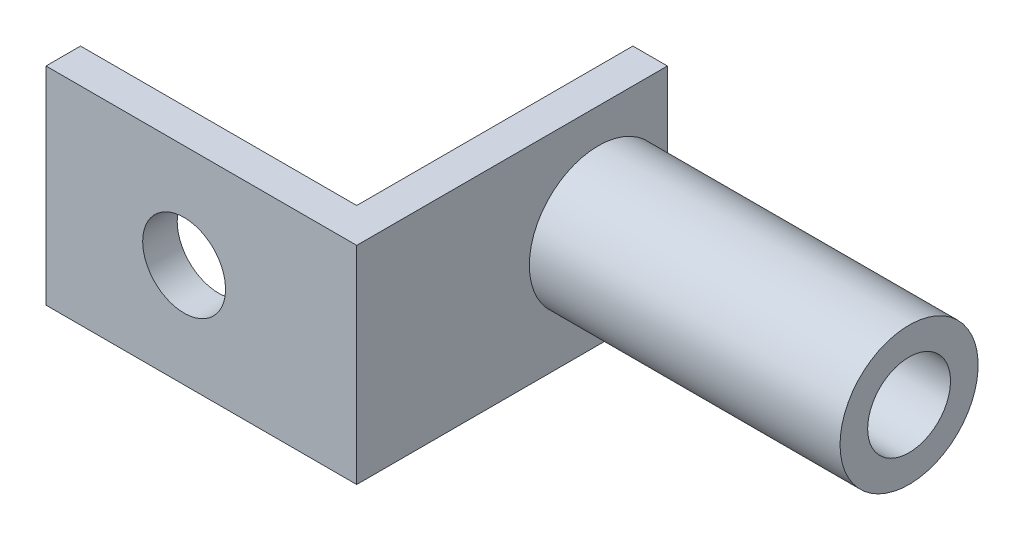
ISO-10303-21;
HEADER;
FILE_DESCRIPTION(('STEP AP214'),'2;1');
FILE_NAME('part.step','',(''),(''),'','','');
FILE_SCHEMA(('AUTOMOTIVE_DESIGN { 1 0 10303 214 1 1 1 1 }'));
ENDSEC;
DATA;
#1=APPLICATION_CONTEXT('core data for automotive mechanical design processes');
#2=APPLICATION_PROTOCOL_DEFINITION('international standard','automotive_design',2000,#1);
#3=PRODUCT_CONTEXT('',#1,'mechanical');
#4=PRODUCT('Part','Part','',(#3));
#5=PRODUCT_RELATED_PRODUCT_CATEGORY('part','',(#4));
#6=PRODUCT_DEFINITION_FORMATION('','',#4);
#7=PRODUCT_DEFINITION_CONTEXT('part definition',#1,'design');
#8=PRODUCT_DEFINITION('design','',#6,#7);
#9=PRODUCT_DEFINITION_SHAPE('','',#8);
#10=(LENGTH_UNIT() NAMED_UNIT(*) SI_UNIT(.MILLI.,.METRE.));
#11=(NAMED_UNIT(*) PLANE_ANGLE_UNIT() SI_UNIT($,.RADIAN.));
#12=(NAMED_UNIT(*) SI_UNIT($,.STERADIAN.) SOLID_ANGLE_UNIT());
#13=UNCERTAINTY_MEASURE_WITH_UNIT(LENGTH_MEASURE(1.E-05),#10,'distance_accuracy_value','');
#14=(GEOMETRIC_REPRESENTATION_CONTEXT(3) GLOBAL_UNCERTAINTY_ASSIGNED_CONTEXT((#13)) GLOBAL_UNIT_ASSIGNED_CONTEXT((#10,
#11,#12)) REPRESENTATION_CONTEXT('',''));
#15=CARTESIAN_POINT('',(0.,0.,0.));
#16=DIRECTION('',(0.,0.,1.));
#17=DIRECTION('',(1.,0.,0.));
#18=AXIS2_PLACEMENT_3D('',#15,#16,#17);
#19=CARTESIAN_POINT('',(0.,15.,-2.5));
#20=DIRECTION('',(1.,0.,0.));
#21=DIRECTION('',(0.,0.,-1.));
#22=AXIS2_PLACEMENT_3D('',#19,#20,#21);
#23=PLANE('',#22);
#24=DIRECTION('',(0.,0.,1.));
#25=VECTOR('',#24,1.);
#26=CARTESIAN_POINT('',(0.,0.,-2.5));
#27=LINE('',#26,#25);
#28=CARTESIAN_POINT('',(0.,0.,-2.5));
#29=VERTEX_POINT('',#28);
#30=CARTESIAN_POINT('',(0.,0.,0.));
#31=VERTEX_POINT('',#30);
#32=EDGE_CURVE('E134',#29,#31,#27,.T.);
#33=ORIENTED_EDGE('',*,*,#32,.T.);
#34=DIRECTION('',(0.,-1.,0.));
#35=VECTOR('',#34,1.);
#36=CARTESIAN_POINT('',(0.,15.,0.));
#37=LINE('',#36,#35);
#38=CARTESIAN_POINT('',(0.,15.,0.));
#39=VERTEX_POINT('',#38);
#40=EDGE_CURVE('E11',#39,#31,#37,.T.);
#41=ORIENTED_EDGE('',*,*,#40,.F.);
#42=DIRECTION('',(0.,0.,1.));
#43=VECTOR('',#42,1.);
#44=CARTESIAN_POINT('',(0.,15.,-2.5));
#45=LINE('',#44,#43);
#46=CARTESIAN_POINT('',(0.,15.,-2.5));
#47=VERTEX_POINT('',#46);
#48=EDGE_CURVE('E153',#47,#39,#45,.T.);
#49=ORIENTED_EDGE('',*,*,#48,.F.);
#50=DIRECTION('',(0.,-1.,0.));
#51=VECTOR('',#50,1.);
#52=CARTESIAN_POINT('',(0.,15.,-2.5));
#53=LINE('',#52,#51);
#54=EDGE_CURVE('E130',#47,#29,#53,.T.);
#55=ORIENTED_EDGE('',*,*,#54,.T.);
#56=EDGE_LOOP('',(#33,#41,#49,#55));
#57=FACE_BOUND('',#56,.T.);
#58=ADVANCED_FACE('F39',(#57),#23,.F.);
#59=CARTESIAN_POINT('',(0.,15.,0.));
#60=DIRECTION('',(0.,0.,-1.));
#61=DIRECTION('',(-1.,0.,0.));
#62=AXIS2_PLACEMENT_3D('',#59,#60,#61);
#63=PLANE('',#62);
#64=CARTESIAN_POINT('',(10.,7.5,0.));
#65=DIRECTION('',(0.,0.,-1.));
#66=DIRECTION('',(-1.,0.,0.));
#67=AXIS2_PLACEMENT_3D('',#64,#65,#66);
#68=CIRCLE('',#67,3.);
#69=CARTESIAN_POINT('',(7.,7.5,0.));
#70=VERTEX_POINT('',#69);
#71=EDGE_CURVE('E139',#70,#70,#68,.T.);
#72=ORIENTED_EDGE('',*,*,#71,.T.);
#73=EDGE_LOOP('',(#72));
#74=FACE_BOUND('',#73,.T.);
#75=DIRECTION('',(1.,0.,0.));
#76=VECTOR('',#75,1.);
#77=CARTESIAN_POINT('',(0.,0.,0.));
#78=LINE('',#77,#76);
#79=CARTESIAN_POINT('',(22.5,0.,0.));
#80=VERTEX_POINT('',#79);
#81=EDGE_CURVE('E138',#31,#80,#78,.T.);
#82=ORIENTED_EDGE('',*,*,#81,.T.);
#83=DIRECTION('',(0.,-1.,0.));
#84=VECTOR('',#83,1.);
#85=CARTESIAN_POINT('',(22.5,15.,0.));
#86=LINE('',#85,#84);
#87=CARTESIAN_POINT('',(22.5,15.,0.));
#88=VERTEX_POINT('',#87);
#89=EDGE_CURVE('E48',#88,#80,#86,.T.);
#90=ORIENTED_EDGE('',*,*,#89,.F.);
#91=DIRECTION('',(1.,0.,0.));
#92=VECTOR('',#91,1.);
#93=CARTESIAN_POINT('',(0.,15.,0.));
#94=LINE('',#93,#92);
#95=EDGE_CURVE('E95',#39,#88,#94,.T.);
#96=ORIENTED_EDGE('',*,*,#95,.F.);
#97=ORIENTED_EDGE('',*,*,#40,.T.);
#98=EDGE_LOOP('',(#82,#90,#96,#97));
#99=FACE_BOUND('',#98,.T.);
#100=ADVANCED_FACE('F218',(#74,#99),#63,.F.);
#101=CARTESIAN_POINT('',(22.5,15.,0.));
#102=DIRECTION('',(-1.,0.,0.));
#103=DIRECTION('',(0.,0.,1.));
#104=AXIS2_PLACEMENT_3D('',#101,#102,#103);
#105=PLANE('',#104);
#106=DIRECTION('',(0.,-1.,0.));
#107=VECTOR('',#106,1.);
#108=CARTESIAN_POINT('',(22.5,15.,-22.5));
#109=LINE('',#108,#107);
#110=CARTESIAN_POINT('',(22.5,7.5,-22.5));
#111=VERTEX_POINT('',#110);
#112=CARTESIAN_POINT('',(22.5,0.,-22.5));
#113=VERTEX_POINT('',#112);
#114=EDGE_CURVE('E123',#111,#113,#109,.T.);
#115=ORIENTED_EDGE('',*,*,#114,.F.);
#116=CARTESIAN_POINT('',(22.5,7.5,-17.5));
#117=DIRECTION('',(-1.,0.,0.));
#118=DIRECTION('',(0.,0.,1.));
#119=AXIS2_PLACEMENT_3D('',#116,#117,#118);
#120=CIRCLE('',#119,5.);
#121=EDGE_CURVE('E53',#111,#111,#120,.T.);
#122=ORIENTED_EDGE('',*,*,#121,.T.);
#123=CARTESIAN_POINT('',(22.5,15.,-22.5));
#124=VERTEX_POINT('',#123);
#125=EDGE_CURVE('E158',#124,#111,#109,.T.);
#126=ORIENTED_EDGE('',*,*,#125,.F.);
#127=DIRECTION('',(0.,0.,-1.));
#128=VECTOR('',#127,1.);
#129=CARTESIAN_POINT('',(22.5,15.,0.));
#130=LINE('',#129,#128);
#131=EDGE_CURVE('E109',#88,#124,#130,.T.);
#132=ORIENTED_EDGE('',*,*,#131,.F.);
#133=ORIENTED_EDGE('',*,*,#89,.T.);
#134=DIRECTION('',(0.,0.,-1.));
#135=VECTOR('',#134,1.);
#136=CARTESIAN_POINT('',(22.5,0.,0.));
#137=LINE('',#136,#135);
#138=EDGE_CURVE('E142',#80,#113,#137,.T.);
#139=ORIENTED_EDGE('',*,*,#138,.T.);
#140=EDGE_LOOP('',(#115,#122,#126,#132,#133,#139));
#141=FACE_BOUND('',#140,.T.);
#142=ADVANCED_FACE('F166',(#141),#105,.F.);
#143=CARTESIAN_POINT('',(22.5,15.,-22.5));
#144=DIRECTION('',(0.,0.,1.));
#145=DIRECTION('',(1.,0.,0.));
#146=AXIS2_PLACEMENT_3D('',#143,#144,#145);
#147=PLANE('',#146);
#148=ORIENTED_EDGE('',*,*,#125,.T.);
#149=ORIENTED_EDGE('',*,*,#114,.T.);
#150=DIRECTION('',(-1.,0.,0.));
#151=VECTOR('',#150,1.);
#152=CARTESIAN_POINT('',(22.5,0.,-22.5));
#153=LINE('',#152,#151);
#154=CARTESIAN_POINT('',(20.,0.,-22.5));
#155=VERTEX_POINT('',#154);
#156=EDGE_CURVE('E119',#113,#155,#153,.T.);
#157=ORIENTED_EDGE('',*,*,#156,.T.);
#158=DIRECTION('',(0.,-1.,0.));
#159=VECTOR('',#158,1.);
#160=CARTESIAN_POINT('',(20.,15.,-22.5));
#161=LINE('',#160,#159);
#162=CARTESIAN_POINT('',(20.,15.,-22.5));
#163=VERTEX_POINT('',#162);
#164=EDGE_CURVE('E116',#163,#155,#161,.T.);
#165=ORIENTED_EDGE('',*,*,#164,.F.);
#166=DIRECTION('',(-1.,0.,0.));
#167=VECTOR('',#166,1.);
#168=CARTESIAN_POINT('',(22.5,15.,-22.5));
#169=LINE('',#168,#167);
#170=EDGE_CURVE('E102',#124,#163,#169,.T.);
#171=ORIENTED_EDGE('',*,*,#170,.F.);
#172=EDGE_LOOP('',(#148,#149,#157,#165,#171));
#173=FACE_BOUND('',#172,.T.);
#174=ADVANCED_FACE('F117',(#173),#147,.F.);
#175=CARTESIAN_POINT('',(20.,15.,-22.5));
#176=DIRECTION('',(1.,0.,0.));
#177=DIRECTION('',(0.,0.,-1.));
#178=AXIS2_PLACEMENT_3D('',#175,#176,#177);
#179=PLANE('',#178);
#180=CARTESIAN_POINT('',(20.,7.5,-17.5));
#181=DIRECTION('',(1.,0.,0.));
#182=DIRECTION('',(0.,0.,-1.));
#183=AXIS2_PLACEMENT_3D('',#180,#181,#182);
#184=CIRCLE('',#183,3.);
#185=CARTESIAN_POINT('',(20.,7.5,-20.5));
#186=VERTEX_POINT('',#185);
#187=EDGE_CURVE('E42',#186,#186,#184,.T.);
#188=ORIENTED_EDGE('',*,*,#187,.T.);
#189=EDGE_LOOP('',(#188));
#190=FACE_BOUND('',#189,.T.);
#191=ORIENTED_EDGE('',*,*,#164,.T.);
#192=DIRECTION('',(0.,0.,1.));
#193=VECTOR('',#192,1.);
#194=CARTESIAN_POINT('',(20.,0.,-22.5));
#195=LINE('',#194,#193);
#196=CARTESIAN_POINT('',(20.,0.,-2.5));
#197=VERTEX_POINT('',#196);
#198=EDGE_CURVE('E148',#155,#197,#195,.T.);
#199=ORIENTED_EDGE('',*,*,#198,.T.);
#200=DIRECTION('',(0.,-1.,0.));
#201=VECTOR('',#200,1.);
#202=CARTESIAN_POINT('',(20.,15.,-2.5));
#203=LINE('',#202,#201);
#204=CARTESIAN_POINT('',(20.,15.,-2.5));
#205=VERTEX_POINT('',#204);
#206=EDGE_CURVE('E124',#205,#197,#203,.T.);
#207=ORIENTED_EDGE('',*,*,#206,.F.);
#208=DIRECTION('',(0.,0.,1.));
#209=VECTOR('',#208,1.);
#210=CARTESIAN_POINT('',(20.,15.,-22.5));
#211=LINE('',#210,#209);
#212=EDGE_CURVE('E106',#163,#205,#211,.T.);
#213=ORIENTED_EDGE('',*,*,#212,.F.);
#214=EDGE_LOOP('',(#191,#199,#207,#213));
#215=FACE_BOUND('',#214,.T.);
#216=ADVANCED_FACE('F126',(#190,#215),#179,.F.);
#217=CARTESIAN_POINT('',(20.,15.,-2.5));
#218=DIRECTION('',(0.,0.,1.));
#219=DIRECTION('',(1.,0.,0.));
#220=AXIS2_PLACEMENT_3D('',#217,#218,#219);
#221=PLANE('',#220);
#222=CARTESIAN_POINT('',(10.,7.5,-2.5));
#223=DIRECTION('',(0.,0.,-1.));
#224=DIRECTION('',(-1.,0.,0.));
#225=AXIS2_PLACEMENT_3D('',#222,#223,#224);
#226=CIRCLE('',#225,3.);
#227=CARTESIAN_POINT('',(7.,7.5,-2.5));
#228=VERTEX_POINT('',#227);
#229=EDGE_CURVE('E179',#228,#228,#226,.T.);
#230=ORIENTED_EDGE('',*,*,#229,.F.);
#231=EDGE_LOOP('',(#230));
#232=FACE_BOUND('',#231,.T.);
#233=DIRECTION('',(-1.,0.,0.));
#234=VECTOR('',#233,1.);
#235=CARTESIAN_POINT('',(20.,0.,-2.5));
#236=LINE('',#235,#234);
#237=EDGE_CURVE('E87',#197,#29,#236,.T.);
#238=ORIENTED_EDGE('',*,*,#237,.T.);
#239=ORIENTED_EDGE('',*,*,#54,.F.);
#240=DIRECTION('',(-1.,0.,0.));
#241=VECTOR('',#240,1.);
#242=CARTESIAN_POINT('',(20.,15.,-2.5));
#243=LINE('',#242,#241);
#244=EDGE_CURVE('E61',#205,#47,#243,.T.);
#245=ORIENTED_EDGE('',*,*,#244,.F.);
#246=ORIENTED_EDGE('',*,*,#206,.T.);
#247=EDGE_LOOP('',(#238,#239,#245,#246));
#248=FACE_BOUND('',#247,.T.);
#249=ADVANCED_FACE('F170',(#232,#248),#221,.F.);
#250=CARTESIAN_POINT('',(0.,15.,0.));
#251=DIRECTION('',(0.,1.,0.));
#252=DIRECTION('',(0.,0.,1.));
#253=AXIS2_PLACEMENT_3D('',#250,#251,#252);
#254=PLANE('',#253);
#255=ORIENTED_EDGE('',*,*,#48,.T.);
#256=ORIENTED_EDGE('',*,*,#95,.T.);
#257=ORIENTED_EDGE('',*,*,#131,.T.);
#258=ORIENTED_EDGE('',*,*,#170,.T.);
#259=ORIENTED_EDGE('',*,*,#212,.T.);
#260=ORIENTED_EDGE('',*,*,#244,.T.);
#261=EDGE_LOOP('',(#255,#256,#257,#258,#259,#260));
#262=FACE_BOUND('',#261,.T.);
#263=ADVANCED_FACE('F104',(#262),#254,.T.);
#264=CARTESIAN_POINT('',(0.,0.,0.));
#265=DIRECTION('',(0.,1.,0.));
#266=DIRECTION('',(0.,0.,1.));
#267=AXIS2_PLACEMENT_3D('',#264,#265,#266);
#268=PLANE('',#267);
#269=ORIENTED_EDGE('',*,*,#32,.F.);
#270=ORIENTED_EDGE('',*,*,#237,.F.);
#271=ORIENTED_EDGE('',*,*,#198,.F.);
#272=ORIENTED_EDGE('',*,*,#156,.F.);
#273=ORIENTED_EDGE('',*,*,#138,.F.);
#274=ORIENTED_EDGE('',*,*,#81,.F.);
#275=EDGE_LOOP('',(#269,#270,#271,#272,#273,#274));
#276=FACE_BOUND('',#275,.T.);
#277=ADVANCED_FACE('F169',(#276),#268,.F.);
#278=CARTESIAN_POINT('',(10.,7.5,0.));
#279=DIRECTION('',(0.,0.,-1.));
#280=DIRECTION('',(-1.,0.,0.));
#281=AXIS2_PLACEMENT_3D('',#278,#279,#280);
#282=CYLINDRICAL_SURFACE('',#281,3.);
#283=ORIENTED_EDGE('',*,*,#71,.F.);
#284=EDGE_LOOP('',(#283));
#285=FACE_BOUND('',#284,.T.);
#286=ORIENTED_EDGE('',*,*,#229,.T.);
#287=EDGE_LOOP('',(#286));
#288=FACE_BOUND('',#287,.T.);
#289=ADVANCED_FACE('F214',(#285,#288),#282,.F.);
#290=CARTESIAN_POINT('',(45.,7.5,-17.5));
#291=DIRECTION('',(-1.,0.,0.));
#292=DIRECTION('',(0.,0.,1.));
#293=AXIS2_PLACEMENT_3D('',#290,#291,#292);
#294=CYLINDRICAL_SURFACE('',#293,5.);
#295=CARTESIAN_POINT('',(45.,7.5,-17.5));
#296=DIRECTION('',(-1.,0.,0.));
#297=DIRECTION('',(0.,0.,1.));
#298=AXIS2_PLACEMENT_3D('',#295,#296,#297);
#299=CIRCLE('',#298,5.);
#300=CARTESIAN_POINT('',(45.,7.5,-12.5));
#301=VERTEX_POINT('',#300);
#302=EDGE_CURVE('E189',#301,#301,#299,.T.);
#303=ORIENTED_EDGE('',*,*,#302,.T.);
#304=EDGE_LOOP('',(#303));
#305=FACE_BOUND('',#304,.T.);
#306=ORIENTED_EDGE('',*,*,#121,.F.);
#307=EDGE_LOOP('',(#306));
#308=FACE_BOUND('',#307,.T.);
#309=ADVANCED_FACE('F206',(#305,#308),#294,.T.);
#310=CARTESIAN_POINT('',(45.,7.5,-17.5));
#311=DIRECTION('',(-1.,0.,0.));
#312=DIRECTION('',(0.,0.,1.));
#313=AXIS2_PLACEMENT_3D('',#310,#311,#312);
#314=CYLINDRICAL_SURFACE('',#313,3.);
#315=CARTESIAN_POINT('',(45.,7.5,-17.5));
#316=DIRECTION('',(-1.,0.,0.));
#317=DIRECTION('',(0.,0.,1.));
#318=AXIS2_PLACEMENT_3D('',#315,#316,#317);
#319=CIRCLE('',#318,3.);
#320=CARTESIAN_POINT('',(45.,7.5,-14.5));
#321=VERTEX_POINT('',#320);
#322=EDGE_CURVE('E193',#321,#321,#319,.T.);
#323=ORIENTED_EDGE('',*,*,#322,.F.);
#324=EDGE_LOOP('',(#323));
#325=FACE_BOUND('',#324,.T.);
#326=ORIENTED_EDGE('',*,*,#187,.F.);
#327=EDGE_LOOP('',(#326));
#328=FACE_BOUND('',#327,.T.);
#329=ADVANCED_FACE('F203',(#325,#328),#314,.F.);
#330=CARTESIAN_POINT('',(45.,7.5,-17.5));
#331=DIRECTION('',(-1.,0.,0.));
#332=DIRECTION('',(0.,0.,1.));
#333=AXIS2_PLACEMENT_3D('',#330,#331,#332);
#334=PLANE('',#333);
#335=ORIENTED_EDGE('',*,*,#322,.T.);
#336=EDGE_LOOP('',(#335));
#337=FACE_BOUND('',#336,.T.);
#338=ORIENTED_EDGE('',*,*,#302,.F.);
#339=EDGE_LOOP('',(#338));
#340=FACE_BOUND('',#339,.T.);
#341=ADVANCED_FACE('F205',(#337,#340),#334,.F.);
#342=CLOSED_SHELL('',(#58,#100,#142,#174,#216,#249,#263,#277,#289,#309,#329,#341));
#343=MANIFOLD_SOLID_BREP('B2',#342);
#344=ADVANCED_BREP_SHAPE_REPRESENTATION('',(#18,#343),#14);
#345=SHAPE_DEFINITION_REPRESENTATION(#9,#344);
ENDSEC;
END-ISO-10303-21;
